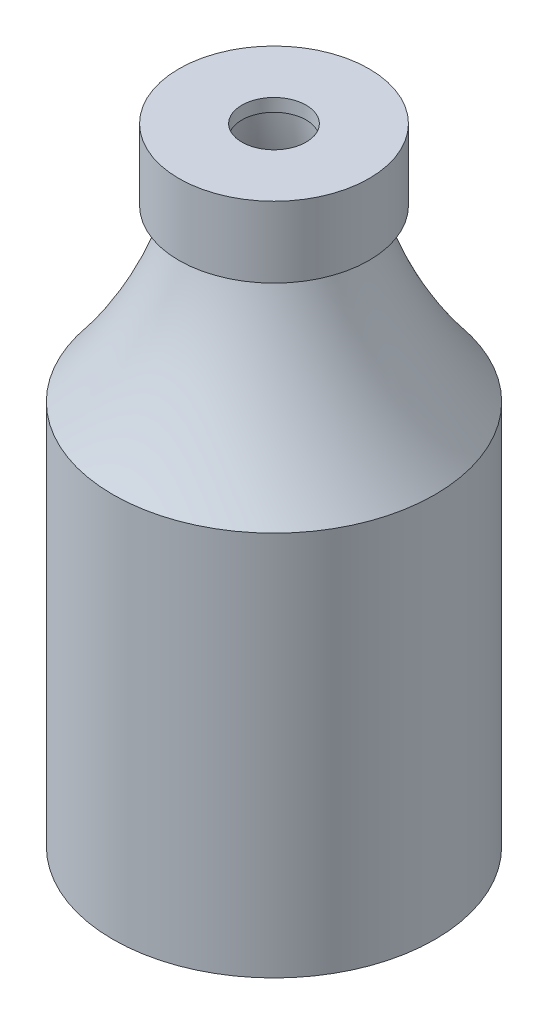
ISO-10303-21;
HEADER;
FILE_DESCRIPTION(('STEP AP214'),'2;1');
FILE_NAME('part.step','',(''),(''),'','','');
FILE_SCHEMA(('AUTOMOTIVE_DESIGN { 1 0 10303 214 1 1 1 1 }'));
ENDSEC;
DATA;
#1=APPLICATION_CONTEXT('core data for automotive mechanical design processes');
#2=APPLICATION_PROTOCOL_DEFINITION('international standard','automotive_design',2000,#1);
#3=PRODUCT_CONTEXT('',#1,'mechanical');
#4=PRODUCT('Part','Part','',(#3));
#5=PRODUCT_RELATED_PRODUCT_CATEGORY('part','',(#4));
#6=PRODUCT_DEFINITION_FORMATION('','',#4);
#7=PRODUCT_DEFINITION_CONTEXT('part definition',#1,'design');
#8=PRODUCT_DEFINITION('design','',#6,#7);
#9=PRODUCT_DEFINITION_SHAPE('','',#8);
#10=(LENGTH_UNIT() NAMED_UNIT(*) SI_UNIT(.MILLI.,.METRE.));
#11=(NAMED_UNIT(*) PLANE_ANGLE_UNIT() SI_UNIT($,.RADIAN.));
#12=(NAMED_UNIT(*) SI_UNIT($,.STERADIAN.) SOLID_ANGLE_UNIT());
#13=UNCERTAINTY_MEASURE_WITH_UNIT(LENGTH_MEASURE(1.E-05),#10,'distance_accuracy_value','');
#14=(GEOMETRIC_REPRESENTATION_CONTEXT(3) GLOBAL_UNCERTAINTY_ASSIGNED_CONTEXT((#13)) GLOBAL_UNIT_ASSIGNED_CONTEXT((#10,
#11,#12)) REPRESENTATION_CONTEXT('',''));
#15=CARTESIAN_POINT('',(0.,0.,0.));
#16=DIRECTION('',(0.,0.,1.));
#17=DIRECTION('',(1.,0.,0.));
#18=AXIS2_PLACEMENT_3D('',#15,#16,#17);
#19=CARTESIAN_POINT('',(-11.9476886076367,26.2565573330915,0.));
#20=DIRECTION('',(0.,1.,0.));
#21=DIRECTION('',(-1.,0.,0.));
#22=AXIS2_PLACEMENT_3D('',#19,#20,#21);
#23=CYLINDRICAL_SURFACE('',#22,12.7);
#24=CARTESIAN_POINT('',(-11.9476886076367,77.0565573330915,0.));
#25=DIRECTION('',(0.,1.,0.));
#26=DIRECTION('',(-1.,0.,0.));
#27=AXIS2_PLACEMENT_3D('',#24,#25,#26);
#28=CIRCLE('',#27,12.7);
#29=CARTESIAN_POINT('',(-24.6476886076367,77.0565573330915,0.));
#30=VERTEX_POINT('',#29);
#31=EDGE_CURVE('E74',#30,#30,#28,.T.);
#32=ORIENTED_EDGE('',*,*,#31,.T.);
#33=EDGE_LOOP('',(#32));
#34=FACE_BOUND('',#33,.T.);
#35=CARTESIAN_POINT('',(-11.9476886076367,71.9765573330896,0.));
#36=DIRECTION('',(0.,-1.,0.));
#37=DIRECTION('',(1.,0.,0.));
#38=AXIS2_PLACEMENT_3D('',#35,#36,#37);
#39=CIRCLE('',#38,12.7);
#40=CARTESIAN_POINT('',(-6.14104712723151,71.9765573330878,-11.2948180471417));
#41=VERTEX_POINT('',#40);
#42=CARTESIAN_POINT('',(-6.14104712723151,71.9765573330878,11.2948180471417));
#43=VERTEX_POINT('',#42);
#44=EDGE_CURVE('E11',#41,#43,#39,.F.);
#45=ORIENTED_EDGE('',*,*,#44,.F.);
#46=CARTESIAN_POINT('',(-6.14104712723151,71.9765573330878,11.2948180471417));
#47=CARTESIAN_POINT('',(-6.02814345890006,71.6302940648625,11.2367533946218));
#48=CARTESIAN_POINT('',(-5.91215774820787,71.2856290318717,11.1750045881095));
#49=CARTESIAN_POINT('',(-5.67385701477465,70.5988020839156,11.042997057075));
#50=CARTESIAN_POINT('',(-5.55152204791732,70.2566524593231,10.9727104552209));
#51=CARTESIAN_POINT('',(-5.30088220755815,69.575851682748,10.8227215506732));
#52=CARTESIAN_POINT('',(-5.17256648754862,69.2372083653992,10.7430017027496));
#53=CARTESIAN_POINT('',(-4.91042243531817,68.564419882714,10.5731407645395));
#54=CARTESIAN_POINT('',(-4.77659052224592,68.2302778322102,10.4829928340065));
#55=CARTESIAN_POINT('',(-4.5022287206481,67.5632866440133,10.2899760756511));
#56=CARTESIAN_POINT('',(-4.36163654028801,67.2305043935716,10.1869639431572));
#57=CARTESIAN_POINT('',(-4.07598964577765,66.5715474779124,9.96788493086616));
#58=CARTESIAN_POINT('',(-3.93093873342895,66.2453675563059,9.85182896041626));
#59=CARTESIAN_POINT('',(-3.63712197988839,65.6006286029127,9.60527092300924));
#60=CARTESIAN_POINT('',(-3.4883598915787,65.2820624631744,9.47478302540033));
#61=CARTESIAN_POINT('',(-3.18796316113138,64.6535593462588,9.19776832001317));
#62=CARTESIAN_POINT('',(-3.03633014786133,64.3436177086052,9.05125039422618));
#63=CARTESIAN_POINT('',(-2.79048717755819,63.8520369292448,8.80076097228544));
#64=CARTESIAN_POINT('',(-2.69682698045365,63.6672808651663,8.702341767763));
#65=CARTESIAN_POINT('',(-2.50915866897921,63.3018670224009,8.49843271768342));
#66=CARTESIAN_POINT('',(-2.41515054052765,63.1212094117461,8.39294258292489));
#67=CARTESIAN_POINT('',(-2.22715823338513,62.7644412912978,8.17447591218834));
#68=CARTESIAN_POINT('',(-2.13317405626044,62.5883310274204,8.06149897250468));
#69=CARTESIAN_POINT('',(-1.94573837935472,62.2413128912031,7.82773397466513));
#70=CARTESIAN_POINT('',(-1.85228651752918,62.0704010203588,7.70695215540906));
#71=CARTESIAN_POINT('',(-1.66633366239688,61.7342112447476,7.45707675258339));
#72=CARTESIAN_POINT('',(-1.57383266208009,61.5689332984248,7.32798323034125));
#73=CARTESIAN_POINT('',(-1.39035514512955,61.2446771961389,7.06108588352679));
#74=CARTESIAN_POINT('',(-1.29937867872689,61.0856992475164,6.92328177266496));
#75=CARTESIAN_POINT('',(-1.07251055110102,60.6933603612869,6.564017857503));
#76=CARTESIAN_POINT('',(-0.938038191270144,60.4646283774027,6.33652994544912));
#77=CARTESIAN_POINT('',(-0.676812061647498,60.0265692416973,5.85929385907999));
#78=CARTESIAN_POINT('',(-0.550059760604809,59.8172457784348,5.60954147105437));
#79=CARTESIAN_POINT('',(-0.307922263239325,59.4223466303356,5.08804814359555));
#80=CARTESIAN_POINT('',(-0.192503668246921,59.2367006569036,4.81637638867361));
#81=CARTESIAN_POINT('',(0.023605215348941,58.8927531808193,4.25082857371928));
#82=CARTESIAN_POINT('',(0.124307311643547,58.7344297374479,3.95697060499364));
#83=CARTESIAN_POINT('',(0.271415533621071,58.5050789033452,3.46715536075098));
#84=CARTESIAN_POINT('',(0.323703114258503,58.4240530026118,3.27758885643394));
#85=CARTESIAN_POINT('',(0.420365341159352,58.2749290819724,2.89150484237477));
#86=CARTESIAN_POINT('',(0.464742459005217,58.2068270236487,2.69498952683001));
#87=CARTESIAN_POINT('',(0.544700514978473,58.0845548078201,2.29599548086767));
#88=CARTESIAN_POINT('',(0.5802847921192,58.0303793614756,2.09351904692887));
#89=CARTESIAN_POINT('',(0.64190940533483,57.936798888267,1.68372946566649));
#90=CARTESIAN_POINT('',(0.667949406793137,57.8973943792621,1.47641614903568));
#91=CARTESIAN_POINT('',(0.709976960878459,57.833895791336,1.05738080816152));
#92=CARTESIAN_POINT('',(0.725914268762047,57.8098782316796,0.845642075506108));
#93=CARTESIAN_POINT('',(0.74713556457105,57.7779141567291,0.420418381015013));
#94=CARTESIAN_POINT('',(0.752419607604222,57.7699675583023,0.206933428218003));
#95=CARTESIAN_POINT('',(0.752199817473933,57.7702982889571,-0.219997509416542));
#96=CARTESIAN_POINT('',(0.746696981711016,57.7785741180443,-0.433443496032003));
#97=CARTESIAN_POINT('',(0.725045273583073,57.8111878135815,-0.85855099546481));
#98=CARTESIAN_POINT('',(0.708896717684562,57.8355252025679,-1.07021256113841));
#99=CARTESIAN_POINT('',(0.667816973691173,57.8975971333573,-1.47569159222867));
#100=CARTESIAN_POINT('',(0.64356358718022,57.9342991366667,-1.66973778500106));
#101=CARTESIAN_POINT('',(0.586672292861466,58.02066899534,-2.05364328392962));
#102=CARTESIAN_POINT('',(0.554035032349335,58.0703358497283,-2.24350291209058));
#103=CARTESIAN_POINT('',(0.48099150856235,58.1819400713975,-2.61807795801787));
#104=CARTESIAN_POINT('',(0.440583687952039,58.2438798984397,-2.80279233608983));
#105=CARTESIAN_POINT('',(0.35270921656761,58.3792243479599,-3.16625848663229));
#106=CARTESIAN_POINT('',(0.305241119897504,58.4526313189853,-3.34500902854819));
#107=CARTESIAN_POINT('',(0.185756100511439,58.6384246033784,-3.75914851366081));
#108=CARTESIAN_POINT('',(0.111055145325748,58.7553275162185,-3.99174864569724));
#109=CARTESIAN_POINT('',(-0.0481018327785355,59.0066053805151,-4.44379510389586));
#110=CARTESIAN_POINT('',(-0.132560788722143,59.1409855867677,-4.66323744487277));
#111=CARTESIAN_POINT('',(-0.309514503570838,59.4253278597886,-5.08882023689238));
#112=CARTESIAN_POINT('',(-0.402020768134672,59.5753122987934,-5.29494088277912));
#113=CARTESIAN_POINT('',(-0.593268766582235,59.888772743047,-5.69350687947144));
#114=CARTESIAN_POINT('',(-0.69201073226135,60.0522492498965,-5.88595172135006));
#115=CARTESIAN_POINT('',(-0.942188905225147,60.4713365580906,-6.34556701494231));
#116=CARTESIAN_POINT('',(-1.09641467640784,60.7338858402427,-6.60491293754797));
#117=CARTESIAN_POINT('',(-1.41112545620132,61.280032044397,-7.09619741832103));
#118=CARTESIAN_POINT('',(-1.57161352149812,61.5636393075529,-7.32812236372582));
#119=CARTESIAN_POINT('',(-1.89589893236964,62.1486719437083,-7.76698749057202));
#120=CARTESIAN_POINT('',(-2.05970191138787,62.4501296838014,-7.97388007935585));
#121=CARTESIAN_POINT('',(-2.38777382442873,63.0673698123946,-8.36439180131616));
#122=CARTESIAN_POINT('',(-2.55204272193642,63.3831511059068,-8.54801270947679));
#123=CARTESIAN_POINT('',(-2.9041454357617,64.0759998387915,-8.92074927301509));
#124=CARTESIAN_POINT('',(-3.09173610348207,64.4550476831517,-9.10640114940811));
#125=CARTESIAN_POINT('',(-3.46275756794178,65.2264721574069,-9.45306430407974));
#126=CARTESIAN_POINT('',(-3.64618557565671,65.6188573079184,-9.61405945447271));
#127=CARTESIAN_POINT('',(-4.00712327864424,66.414648645628,-9.91425883862026));
#128=CARTESIAN_POINT('',(-4.18463104018318,66.8180583570024,-10.0534560062974));
#129=CARTESIAN_POINT('',(-4.53244875066622,67.6341282826355,-10.3126748803928));
#130=CARTESIAN_POINT('',(-4.70275681288141,68.0467908788445,-10.4326915830735));
#131=CARTESIAN_POINT('',(-5.03512740772594,68.8796896871069,-10.6558216912321));
#132=CARTESIAN_POINT('',(-5.19719327034537,69.2999227461258,-10.7589419611789));
#133=CARTESIAN_POINT('',(-5.51243158859849,70.1468797487862,-10.9504093603344));
#134=CARTESIAN_POINT('',(-5.66560666616255,70.5736017314862,-11.0387608595144));
#135=CARTESIAN_POINT('',(-5.86997341417767,71.1647293454662,-11.1514768343819));
#136=CARTESIAN_POINT('',(-5.925179002557,71.3267225690558,-11.1813771031093));
#137=CARTESIAN_POINT('',(-6.03416275318171,71.6512098791171,-11.2393957987073));
#138=CARTESIAN_POINT('',(-6.08794305737032,71.8137027500045,-11.2675169991547));
#139=CARTESIAN_POINT('',(-6.14104712723151,71.9765573330878,-11.2948180471417));
#140=B_SPLINE_CURVE_WITH_KNOTS('',3,(#46,#47,#48,#49,#50,#51,#52,#53,#54,#55,#56,#57,#58,#59,
#60,#61,#62,#63,#64,#65,#66,#67,#68,#69,#70,#71,#72,#73,#74,#75,#76,#77,#78,#79,#80,#81,#82,#83,
#84,#85,#86,#87,#88,#89,#90,#91,#92,#93,#94,#95,#96,#97,#98,#99,#100,#101,#102,#103,#104,#105,
#106,#107,#108,#109,#110,#111,#112,#113,#114,#115,#116,#117,#118,#119,#120,#121,#122,#123,#124,
#125,#126,#127,#128,#129,#130,#131,#132,#133,#134,#135,#136,#137,#138,#139),.UNSPECIFIED.,.F.,
.F.,(4,2,2,2,2,2,2,2,2,2,2,2,2,2,2,2,2,2,2,2,2,2,2,2,2,2,2,2,2,2,2,2,2,2,2,2,2,2,2,2,2,2,2,2,2,
2,4),(0.,1.10641412282407,2.21654321755249,3.32877053223375,4.4417315883907,5.56843253597954,
6.69419807115826,7.81886797384753,8.9429178404135,9.63079036349388,10.3186910377811,
11.0066288354753,11.694023368329,12.3814128298593,13.0688248954669,14.1160985507621,
15.1635708325447,16.2078574081938,17.2513014518146,17.8887878252857,18.5260746690366,
19.163119134828,19.8001859328814,20.4403967621407,21.0806042796759,21.7207526037022,
22.3608818988256,22.9571379899464,23.5533480596164,24.1496777433889,24.7461297199601,
25.5574083659873,26.368931500784,27.1816346066019,27.9943679402706,29.192387655733,
30.3909996361701,31.5918558088539,32.7926203343076,34.1772461046029,35.5627737212879,
36.9487495477643,38.3350863549778,39.7208585347684,41.1062199460877,41.6274106496959,
42.1477677033004),.UNSPECIFIED.);
#141=EDGE_CURVE('E58',#43,#41,#140,.T.);
#142=ORIENTED_EDGE('',*,*,#141,.F.);
#143=EDGE_LOOP('',(#45,#142));
#144=FACE_BOUND('',#143,.T.);
#145=ADVANCED_FACE('F49',(#34,#144),#23,.F.);
#146=CARTESIAN_POINT('',(-11.9476886076367,-170.628560351845,0.));
#147=DIRECTION('',(0.,-1.,0.));
#148=DIRECTION('',(1.,0.,0.));
#149=AXIS2_PLACEMENT_3D('',#146,#147,#148);
#150=PLANE('',#149);
#151=CARTESIAN_POINT('',(-11.9476886076367,-170.628560351845,0.));
#152=DIRECTION('',(0.,1.,0.));
#153=DIRECTION('',(-1.,0.,0.));
#154=AXIS2_PLACEMENT_3D('',#151,#152,#153);
#155=CIRCLE('',#154,63.6904588332694);
#156=CARTESIAN_POINT('',(-75.6381474409061,-170.628560351845,0.));
#157=VERTEX_POINT('',#156);
#158=EDGE_CURVE('E153',#157,#157,#155,.T.);
#159=ORIENTED_EDGE('',*,*,#158,.F.);
#160=EDGE_LOOP('',(#159));
#161=FACE_BOUND('',#160,.T.);
#162=ADVANCED_FACE('F78',(#161),#150,.T.);
#163=CARTESIAN_POINT('',(-11.9476886076367,77.0565573330915,0.));
#164=DIRECTION('',(0.,1.,0.));
#165=DIRECTION('',(-1.,0.,0.));
#166=AXIS2_PLACEMENT_3D('',#163,#164,#165);
#167=CYLINDRICAL_SURFACE('',#166,63.6904588332694);
#168=ORIENTED_EDGE('',*,*,#158,.T.);
#169=EDGE_LOOP('',(#168));
#170=FACE_BOUND('',#169,.T.);
#171=CARTESIAN_POINT('',(-11.9476886076367,-18.228560351845,0.));
#172=DIRECTION('',(0.,1.,0.));
#173=DIRECTION('',(-1.,0.,0.));
#174=AXIS2_PLACEMENT_3D('',#171,#172,#173);
#175=CIRCLE('',#174,63.6904588332694);
#176=CARTESIAN_POINT('',(-75.6381474409061,-18.228560351845,0.));
#177=VERTEX_POINT('',#176);
#178=EDGE_CURVE('E132',#177,#177,#175,.T.);
#179=ORIENTED_EDGE('',*,*,#178,.F.);
#180=EDGE_LOOP('',(#179));
#181=FACE_BOUND('',#180,.T.);
#182=ADVANCED_FACE('F86',(#170,#181),#167,.T.);
#183=CARTESIAN_POINT('',(-37.3476886076367,77.0565573330915,0.));
#184=CARTESIAN_POINT('',(-41.4077909499398,25.6038979825661,0.));
#185=CARTESIAN_POINT('',(-75.6381474409061,-18.228560351845,0.));
#186=B_SPLINE_CURVE_WITH_KNOTS('',2,(#183,#184,#185),.UNSPECIFIED.,.F.,.F.,(3,3),(0.,1.),.UNSPECIFIED.);
#187=CARTESIAN_POINT('',(-11.9476886076367,77.0565573330915,0.));
#188=DIRECTION('',(0.,1.,0.));
#189=AXIS1_PLACEMENT('',#187,#188);
#190=SURFACE_OF_REVOLUTION('',#186,#189);
#191=CARTESIAN_POINT('',(-11.9476886076367,48.9975873116131,0.));
#192=DIRECTION('',(0.,1.,0.));
#193=DIRECTION('',(-1.,0.,0.));
#194=AXIS2_PLACEMENT_3D('',#191,#192,#193);
#195=CIRCLE('',#194,29.9992457281103);
#196=CARTESIAN_POINT('',(-41.946934335747,48.9975873116131,0.));
#197=VERTEX_POINT('',#196);
#198=EDGE_CURVE('E70',#197,#197,#195,.T.);
#199=ORIENTED_EDGE('',*,*,#198,.F.);
#200=EDGE_LOOP('',(#199));
#201=FACE_BOUND('',#200,.T.);
#202=ORIENTED_EDGE('',*,*,#178,.T.);
#203=EDGE_LOOP('',(#202));
#204=FACE_BOUND('',#203,.T.);
#205=ADVANCED_FACE('F141',(#201,#204),#190,.F.);
#206=CARTESIAN_POINT('',(-11.9476886076367,-170.628560351845,0.));
#207=DIRECTION('',(0.,-1.,0.));
#208=DIRECTION('',(1.,0.,0.));
#209=AXIS2_PLACEMENT_3D('',#206,#207,#208);
#210=CYLINDRICAL_SURFACE('',#209,37.6192457325054);
#211=CARTESIAN_POINT('',(-11.9476886076367,77.0565573504447,0.));
#212=DIRECTION('',(0.,-1.,0.));
#213=DIRECTION('',(1.,0.,0.));
#214=AXIS2_PLACEMENT_3D('',#211,#212,#213);
#215=CIRCLE('',#214,37.6192457325054);
#216=CARTESIAN_POINT('',(25.6715571248687,77.0565573504447,0.));
#217=VERTEX_POINT('',#216);
#218=EDGE_CURVE('E128',#217,#217,#215,.T.);
#219=ORIENTED_EDGE('',*,*,#218,.T.);
#220=EDGE_LOOP('',(#219));
#221=FACE_BOUND('',#220,.T.);
#222=CARTESIAN_POINT('',(-11.9476886076367,48.9975873116131,0.));
#223=DIRECTION('',(0.,-1.,0.));
#224=DIRECTION('',(1.,0.,0.));
#225=AXIS2_PLACEMENT_3D('',#222,#223,#224);
#226=CIRCLE('',#225,37.6192457325054);
#227=CARTESIAN_POINT('',(25.6715571248687,48.9975873116131,0.));
#228=VERTEX_POINT('',#227);
#229=EDGE_CURVE('E124',#228,#228,#226,.T.);
#230=ORIENTED_EDGE('',*,*,#229,.F.);
#231=EDGE_LOOP('',(#230));
#232=FACE_BOUND('',#231,.T.);
#233=ADVANCED_FACE('F144',(#221,#232),#210,.T.);
#234=CARTESIAN_POINT('',(0.,48.9975873116131,0.));
#235=DIRECTION('',(0.,-1.,0.));
#236=DIRECTION('',(1.,0.,0.));
#237=AXIS2_PLACEMENT_3D('',#234,#235,#236);
#238=PLANE('',#237);
#239=ORIENTED_EDGE('',*,*,#229,.T.);
#240=EDGE_LOOP('',(#239));
#241=FACE_BOUND('',#240,.T.);
#242=ORIENTED_EDGE('',*,*,#198,.T.);
#243=EDGE_LOOP('',(#242));
#244=FACE_BOUND('',#243,.T.);
#245=ADVANCED_FACE('F93',(#241,#244),#238,.T.);
#246=CARTESIAN_POINT('',(-11.9476886076367,77.0565573330915,0.));
#247=DIRECTION('',(0.,1.,0.));
#248=DIRECTION('',(-1.,0.,0.));
#249=AXIS2_PLACEMENT_3D('',#246,#247,#248);
#250=PLANE('',#249);
#251=ORIENTED_EDGE('',*,*,#31,.F.);
#252=EDGE_LOOP('',(#251));
#253=FACE_BOUND('',#252,.T.);
#254=ORIENTED_EDGE('',*,*,#218,.F.);
#255=EDGE_LOOP('',(#254));
#256=FACE_BOUND('',#255,.T.);
#257=ADVANCED_FACE('F51',(#253,#256),#250,.T.);
#258=CARTESIAN_POINT('',(-17.0276886076367,71.9765573330896,0.));
#259=DIRECTION('',(0.,-1.,0.));
#260=DIRECTION('',(1.,0.,0.));
#261=AXIS2_PLACEMENT_3D('',#258,#259,#260);
#262=PLANE('',#261);
#263=ORIENTED_EDGE('',*,*,#44,.T.);
#264=CARTESIAN_POINT('',(-17.0276886076367,71.9765573330878,0.));
#265=DIRECTION('',(0.,-1.,0.));
#266=DIRECTION('',(1.,0.,0.));
#267=AXIS2_PLACEMENT_3D('',#264,#265,#266);
#268=CIRCLE('',#267,15.6873158137687);
#269=EDGE_CURVE('E64',#43,#41,#268,.T.);
#270=ORIENTED_EDGE('',*,*,#269,.T.);
#271=EDGE_LOOP('',(#263,#270));
#272=FACE_BOUND('',#271,.T.);
#273=ADVANCED_FACE('F72',(#272),#262,.T.);
#274=CARTESIAN_POINT('',(-32.7150044214054,71.9765573330878,0.));
#275=CARTESIAN_POINT('',(-34.4915484653025,55.1524066338395,0.));
#276=CARTESIAN_POINT('',(-38.6390105819429,39.0073176930895,0.));
#277=CARTESIAN_POINT('',(-45.8997051200409,21.5872769894471,0.));
#278=CARTESIAN_POINT('',(-46.7425133481235,19.6620462215594,0.));
#279=CARTESIAN_POINT('',(-48.5000485006763,15.8321831353768,0.));
#280=CARTESIAN_POINT('',(-49.4162789658151,13.9246869308356,0.));
#281=CARTESIAN_POINT('',(-52.2565767631585,8.26403653036553,0.));
#282=CARTESIAN_POINT('',(-54.274096029425,4.56734771886329,0.));
#283=CARTESIAN_POINT('',(-60.6762819099356,-6.30536860025343,0.));
#284=CARTESIAN_POINT('',(-65.4099692548793,-13.2644235589176,0.));
#285=CARTESIAN_POINT('',(-70.5581474409176,-19.9658057594644,0.));
#286=B_SPLINE_CURVE_WITH_KNOTS('',3,(#274,#275,#276,#277,#278,#279,#280,#281,#282,#283,#284,
#285),.UNSPECIFIED.,.F.,.F.,(4,2,2,2,2,4),(0.,0.5,0.5625,0.625,0.75,1.),.UNSPECIFIED.);
#287=CARTESIAN_POINT('',(-17.0276886076367,-165.548560351845,0.));
#288=DIRECTION('',(0.,-1.,0.));
#289=AXIS1_PLACEMENT('',#287,#288);
#290=SURFACE_OF_REVOLUTION('',#286,#289);
#291=CARTESIAN_POINT('',(-17.0276886076367,-19.9658057594644,0.));
#292=DIRECTION('',(0.,-1.,0.));
#293=DIRECTION('',(1.,0.,0.));
#294=AXIS2_PLACEMENT_3D('',#291,#292,#293);
#295=CIRCLE('',#294,53.5304588332809);
#296=CARTESIAN_POINT('',(36.5027702256441,-19.9658057594643,0.));
#297=VERTEX_POINT('',#296);
#298=EDGE_CURVE('E75',#297,#297,#295,.T.);
#299=ORIENTED_EDGE('',*,*,#298,.T.);
#300=EDGE_LOOP('',(#299));
#301=FACE_BOUND('',#300,.T.);
#302=ORIENTED_EDGE('',*,*,#141,.T.);
#303=ORIENTED_EDGE('',*,*,#269,.F.);
#304=EDGE_LOOP('',(#302,#303));
#305=FACE_BOUND('',#304,.T.);
#306=ADVANCED_FACE('F66',(#301,#305),#290,.F.);
#307=CARTESIAN_POINT('',(-17.0276886076367,-165.548560351845,0.));
#308=DIRECTION('',(0.,-1.,0.));
#309=DIRECTION('',(1.,0.,0.));
#310=AXIS2_PLACEMENT_3D('',#307,#308,#309);
#311=CYLINDRICAL_SURFACE('',#310,53.5304588332751);
#312=CARTESIAN_POINT('',(-17.0276886076367,-165.548560351845,0.));
#313=DIRECTION('',(0.,-1.,0.));
#314=DIRECTION('',(1.,0.,0.));
#315=AXIS2_PLACEMENT_3D('',#312,#313,#314);
#316=CIRCLE('',#315,53.5304588332694);
#317=CARTESIAN_POINT('',(36.5027702256327,-165.548560351845,0.));
#318=VERTEX_POINT('',#317);
#319=EDGE_CURVE('E112',#318,#318,#316,.T.);
#320=ORIENTED_EDGE('',*,*,#319,.T.);
#321=EDGE_LOOP('',(#320));
#322=FACE_BOUND('',#321,.T.);
#323=ORIENTED_EDGE('',*,*,#298,.F.);
#324=EDGE_LOOP('',(#323));
#325=FACE_BOUND('',#324,.T.);
#326=ADVANCED_FACE('F105',(#322,#325),#311,.F.);
#327=CARTESIAN_POINT('',(-70.5581474409061,-165.548560351845,0.));
#328=DIRECTION('',(0.,1.,0.));
#329=DIRECTION('',(-1.,0.,0.));
#330=AXIS2_PLACEMENT_3D('',#327,#328,#329);
#331=PLANE('',#330);
#332=ORIENTED_EDGE('',*,*,#319,.F.);
#333=EDGE_LOOP('',(#332));
#334=FACE_BOUND('',#333,.T.);
#335=ADVANCED_FACE('F229',(#334),#331,.T.);
#336=CLOSED_SHELL('',(#145,#162,#182,#205,#233,#245,#257,#273,#306,#326,#335));
#337=MANIFOLD_SOLID_BREP('B2',#336);
#338=ADVANCED_BREP_SHAPE_REPRESENTATION('',(#18,#337),#14);
#339=SHAPE_DEFINITION_REPRESENTATION(#9,#338);
ENDSEC;
END-ISO-10303-21;
